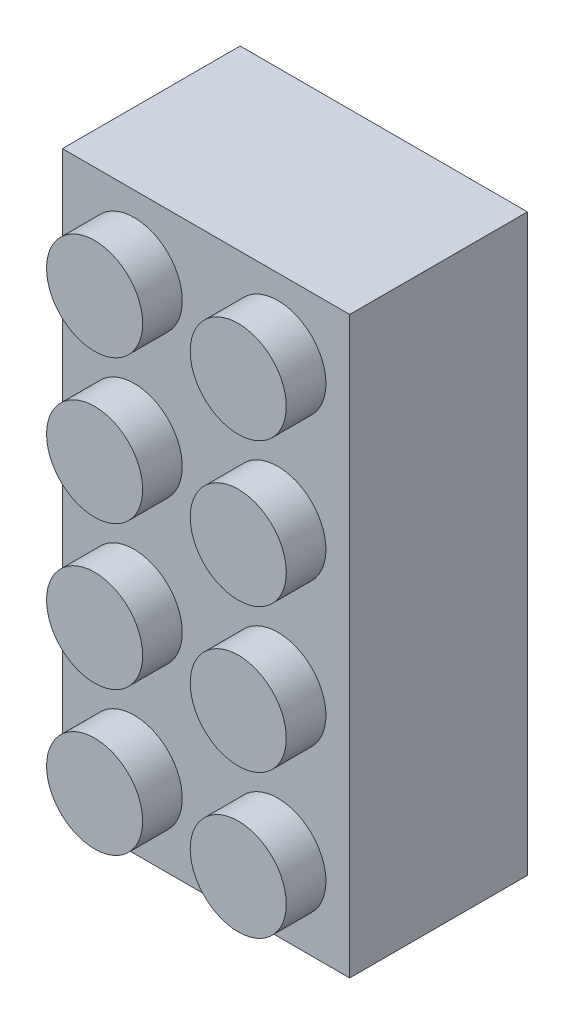
ISO-10303-21;
HEADER;
FILE_DESCRIPTION(('STEP AP214'),'2;1');
FILE_NAME('part.step','',(''),(''),'','','');
FILE_SCHEMA(('AUTOMOTIVE_DESIGN { 1 0 10303 214 1 1 1 1 }'));
ENDSEC;
DATA;
#1=APPLICATION_CONTEXT('core data for automotive mechanical design processes');
#2=APPLICATION_PROTOCOL_DEFINITION('international standard','automotive_design',2000,#1);
#3=PRODUCT_CONTEXT('',#1,'mechanical');
#4=PRODUCT('Part','Part','',(#3));
#5=PRODUCT_RELATED_PRODUCT_CATEGORY('part','',(#4));
#6=PRODUCT_DEFINITION_FORMATION('','',#4);
#7=PRODUCT_DEFINITION_CONTEXT('part definition',#1,'design');
#8=PRODUCT_DEFINITION('design','',#6,#7);
#9=PRODUCT_DEFINITION_SHAPE('','',#8);
#10=(LENGTH_UNIT() NAMED_UNIT(*) SI_UNIT(.MILLI.,.METRE.));
#11=(NAMED_UNIT(*) PLANE_ANGLE_UNIT() SI_UNIT($,.RADIAN.));
#12=(NAMED_UNIT(*) SI_UNIT($,.STERADIAN.) SOLID_ANGLE_UNIT());
#13=UNCERTAINTY_MEASURE_WITH_UNIT(LENGTH_MEASURE(1.E-05),#10,'distance_accuracy_value','');
#14=(GEOMETRIC_REPRESENTATION_CONTEXT(3) GLOBAL_UNCERTAINTY_ASSIGNED_CONTEXT((#13)) GLOBAL_UNIT_ASSIGNED_CONTEXT((#10,
#11,#12)) REPRESENTATION_CONTEXT('',''));
#15=CARTESIAN_POINT('',(0.,0.,0.));
#16=DIRECTION('',(0.,0.,1.));
#17=DIRECTION('',(1.,0.,0.));
#18=AXIS2_PLACEMENT_3D('',#15,#16,#17);
#19=CARTESIAN_POINT('',(-47.4341050467337,-10.483954881613,12.5497480286861));
#20=DIRECTION('',(0.,0.,-1.));
#21=DIRECTION('',(-1.,0.,0.));
#22=AXIS2_PLACEMENT_3D('',#19,#20,#21);
#23=PLANE('',#22);
#24=DIRECTION('',(-1.,0.,0.));
#25=VECTOR('',#24,1.);
#26=CARTESIAN_POINT('',(-47.4341050467337,85.2160451183871,12.5497480286861));
#27=LINE('',#26,#25);
#28=CARTESIAN_POINT('',(48.2658949532663,85.2160451183871,12.5497480286861));
#29=VERTEX_POINT('',#28);
#30=CARTESIAN_POINT('',(-47.4341050467337,85.2160451183871,12.5497480286861));
#31=VERTEX_POINT('',#30);
#32=EDGE_CURVE('E92',#29,#31,#27,.T.);
#33=ORIENTED_EDGE('',*,*,#32,.F.);
#34=DIRECTION('',(0.,1.,0.));
#35=VECTOR('',#34,1.);
#36=CARTESIAN_POINT('',(48.2658949532663,85.2160451183871,12.5497480286861));
#37=LINE('',#36,#35);
#38=CARTESIAN_POINT('',(48.2658949532664,-106.183954881613,12.5497480286861));
#39=VERTEX_POINT('',#38);
#40=EDGE_CURVE('E74',#39,#29,#37,.T.);
#41=ORIENTED_EDGE('',*,*,#40,.F.);
#42=DIRECTION('',(1.,0.,0.));
#43=VECTOR('',#42,1.);
#44=CARTESIAN_POINT('',(48.2658949532664,-106.183954881613,12.5497480286861));
#45=LINE('',#44,#43);
#46=CARTESIAN_POINT('',(-47.4341050467337,-106.183954881613,12.5497480286861));
#47=VERTEX_POINT('',#46);
#48=EDGE_CURVE('E211',#47,#39,#45,.T.);
#49=ORIENTED_EDGE('',*,*,#48,.F.);
#50=DIRECTION('',(0.,-1.,0.));
#51=VECTOR('',#50,1.);
#52=CARTESIAN_POINT('',(-47.4341050467337,85.2160451183871,12.5497480286861));
#53=LINE('',#52,#51);
#54=EDGE_CURVE('E87',#31,#47,#53,.T.);
#55=ORIENTED_EDGE('',*,*,#54,.F.);
#56=EDGE_LOOP('',(#33,#41,#49,#55));
#57=FACE_BOUND('',#56,.T.);
#58=DIRECTION('',(1.,0.,0.));
#59=VECTOR('',#58,1.);
#60=CARTESIAN_POINT('',(-47.4341050467337,-1.88395488161296,12.5497480286861));
#61=LINE('',#60,#59);
#62=CARTESIAN_POINT('',(-38.8341050467337,-1.88395488161296,12.5497480286861));
#63=VERTEX_POINT('',#62);
#64=CARTESIAN_POINT('',(39.6658949532663,-1.88395488161296,12.5497480286861));
#65=VERTEX_POINT('',#64);
#66=EDGE_CURVE('E168',#63,#65,#61,.T.);
#67=ORIENTED_EDGE('',*,*,#66,.T.);
#68=DIRECTION('',(0.,1.,0.));
#69=VECTOR('',#68,1.);
#70=CARTESIAN_POINT('',(39.6658949532663,-10.483954881613,12.5497480286861));
#71=LINE('',#70,#69);
#72=CARTESIAN_POINT('',(39.6658949532663,76.6160451183871,12.5497480286861));
#73=VERTEX_POINT('',#72);
#74=EDGE_CURVE('E51',#65,#73,#71,.T.);
#75=ORIENTED_EDGE('',*,*,#74,.T.);
#76=DIRECTION('',(-1.,0.,0.));
#77=VECTOR('',#76,1.);
#78=CARTESIAN_POINT('',(-47.4341050467337,76.6160451183871,12.5497480286861));
#79=LINE('',#78,#77);
#80=CARTESIAN_POINT('',(-38.8341050467337,76.6160451183871,12.5497480286861));
#81=VERTEX_POINT('',#80);
#82=EDGE_CURVE('E152',#73,#81,#79,.T.);
#83=ORIENTED_EDGE('',*,*,#82,.T.);
#84=DIRECTION('',(0.,-1.,0.));
#85=VECTOR('',#84,1.);
#86=CARTESIAN_POINT('',(-38.8341050467337,-10.483954881613,12.5497480286861));
#87=LINE('',#86,#85);
#88=EDGE_CURVE('E171',#81,#63,#87,.T.);
#89=ORIENTED_EDGE('',*,*,#88,.T.);
#90=EDGE_LOOP('',(#67,#75,#83,#89));
#91=FACE_BOUND('',#90,.T.);
#92=DIRECTION('',(1.,0.,0.));
#93=VECTOR('',#92,1.);
#94=CARTESIAN_POINT('',(-47.4341050467337,-97.583954881613,12.5497480286861));
#95=LINE('',#94,#93);
#96=CARTESIAN_POINT('',(-38.8341050467337,-97.583954881613,12.5497480286861));
#97=VERTEX_POINT('',#96);
#98=CARTESIAN_POINT('',(39.6658949532664,-97.583954881613,12.5497480286861));
#99=VERTEX_POINT('',#98);
#100=EDGE_CURVE('E249',#97,#99,#95,.T.);
#101=ORIENTED_EDGE('',*,*,#100,.T.);
#102=DIRECTION('',(0.,1.,0.));
#103=VECTOR('',#102,1.);
#104=CARTESIAN_POINT('',(39.6658949532664,-106.183954881613,12.5497480286861));
#105=LINE('',#104,#103);
#106=CARTESIAN_POINT('',(39.6658949532664,-19.083954881613,12.5497480286861));
#107=VERTEX_POINT('',#106);
#108=EDGE_CURVE('E252',#99,#107,#105,.T.);
#109=ORIENTED_EDGE('',*,*,#108,.T.);
#110=DIRECTION('',(-1.,0.,0.));
#111=VECTOR('',#110,1.);
#112=CARTESIAN_POINT('',(-47.4341050467337,-19.083954881613,12.5497480286861));
#113=LINE('',#112,#111);
#114=CARTESIAN_POINT('',(-38.8341050467337,-19.083954881613,12.5497480286861));
#115=VERTEX_POINT('',#114);
#116=EDGE_CURVE('E242',#107,#115,#113,.T.);
#117=ORIENTED_EDGE('',*,*,#116,.T.);
#118=DIRECTION('',(0.,-1.,0.));
#119=VECTOR('',#118,1.);
#120=CARTESIAN_POINT('',(-38.8341050467337,-106.183954881613,12.5497480286861));
#121=LINE('',#120,#119);
#122=EDGE_CURVE('E246',#115,#97,#121,.T.);
#123=ORIENTED_EDGE('',*,*,#122,.T.);
#124=EDGE_LOOP('',(#101,#109,#117,#123));
#125=FACE_BOUND('',#124,.T.);
#126=ADVANCED_FACE('F36',(#57,#91,#125),#23,.T.);
#127=CARTESIAN_POINT('',(-47.4341050467337,85.2160451183871,71.7497480286861));
#128=DIRECTION('',(0.,-1.,0.));
#129=DIRECTION('',(1.,0.,0.));
#130=AXIS2_PLACEMENT_3D('',#127,#128,#129);
#131=PLANE('',#130);
#132=ORIENTED_EDGE('',*,*,#32,.T.);
#133=DIRECTION('',(0.,0.,-1.));
#134=VECTOR('',#133,1.);
#135=CARTESIAN_POINT('',(-47.4341050467337,85.2160451183871,71.7497480286861));
#136=LINE('',#135,#134);
#137=CARTESIAN_POINT('',(-47.4341050467337,85.2160451183871,71.7497480286861));
#138=VERTEX_POINT('',#137);
#139=EDGE_CURVE('E93',#138,#31,#136,.T.);
#140=ORIENTED_EDGE('',*,*,#139,.F.);
#141=DIRECTION('',(-1.,0.,0.));
#142=VECTOR('',#141,1.);
#143=CARTESIAN_POINT('',(-47.4341050467337,85.2160451183871,71.7497480286861));
#144=LINE('',#143,#142);
#145=CARTESIAN_POINT('',(48.2658949532663,85.2160451183871,71.7497480286861));
#146=VERTEX_POINT('',#145);
#147=EDGE_CURVE('E86',#146,#138,#144,.T.);
#148=ORIENTED_EDGE('',*,*,#147,.F.);
#149=DIRECTION('',(0.,0.,-1.));
#150=VECTOR('',#149,1.);
#151=CARTESIAN_POINT('',(48.2658949532663,85.2160451183871,71.7497480286861));
#152=LINE('',#151,#150);
#153=EDGE_CURVE('E77',#146,#29,#152,.T.);
#154=ORIENTED_EDGE('',*,*,#153,.T.);
#155=EDGE_LOOP('',(#132,#140,#148,#154));
#156=FACE_BOUND('',#155,.T.);
#157=ADVANCED_FACE('F38',(#156),#131,.F.);
#158=CARTESIAN_POINT('',(-47.4341050467337,85.2160451183871,71.7497480286861));
#159=DIRECTION('',(1.,0.,0.));
#160=DIRECTION('',(0.,1.,0.));
#161=AXIS2_PLACEMENT_3D('',#158,#159,#160);
#162=PLANE('',#161);
#163=ORIENTED_EDGE('',*,*,#54,.T.);
#164=DIRECTION('',(0.,0.,-1.));
#165=VECTOR('',#164,1.);
#166=CARTESIAN_POINT('',(-47.4341050467337,-106.183954881613,71.7497480286861));
#167=LINE('',#166,#165);
#168=CARTESIAN_POINT('',(-47.4341050467337,-106.183954881613,71.7497480286861));
#169=VERTEX_POINT('',#168);
#170=EDGE_CURVE('E134',#169,#47,#167,.T.);
#171=ORIENTED_EDGE('',*,*,#170,.F.);
#172=DIRECTION('',(0.,-1.,0.));
#173=VECTOR('',#172,1.);
#174=CARTESIAN_POINT('',(-47.4341050467337,85.2160451183871,71.7497480286861));
#175=LINE('',#174,#173);
#176=EDGE_CURVE('E199',#138,#169,#175,.T.);
#177=ORIENTED_EDGE('',*,*,#176,.F.);
#178=ORIENTED_EDGE('',*,*,#139,.T.);
#179=EDGE_LOOP('',(#163,#171,#177,#178));
#180=FACE_BOUND('',#179,.T.);
#181=ADVANCED_FACE('F207',(#180),#162,.F.);
#182=CARTESIAN_POINT('',(48.2658949532663,85.2160451183871,71.7497480286861));
#183=DIRECTION('',(-1.,0.,0.));
#184=DIRECTION('',(0.,-1.,0.));
#185=AXIS2_PLACEMENT_3D('',#182,#183,#184);
#186=PLANE('',#185);
#187=ORIENTED_EDGE('',*,*,#40,.T.);
#188=ORIENTED_EDGE('',*,*,#153,.F.);
#189=DIRECTION('',(0.,1.,0.));
#190=VECTOR('',#189,1.);
#191=CARTESIAN_POINT('',(48.2658949532663,85.2160451183871,71.7497480286861));
#192=LINE('',#191,#190);
#193=CARTESIAN_POINT('',(48.2658949532664,-106.183954881613,71.7497480286861));
#194=VERTEX_POINT('',#193);
#195=EDGE_CURVE('E60',#194,#146,#192,.T.);
#196=ORIENTED_EDGE('',*,*,#195,.F.);
#197=DIRECTION('',(0.,0.,-1.));
#198=VECTOR('',#197,1.);
#199=CARTESIAN_POINT('',(48.2658949532664,-106.183954881613,71.7497480286861));
#200=LINE('',#199,#198);
#201=EDGE_CURVE('E81',#194,#39,#200,.T.);
#202=ORIENTED_EDGE('',*,*,#201,.T.);
#203=EDGE_LOOP('',(#187,#188,#196,#202));
#204=FACE_BOUND('',#203,.T.);
#205=ADVANCED_FACE('F76',(#204),#186,.F.);
#206=CARTESIAN_POINT('',(-47.4341050467337,-10.483954881613,71.7497480286861));
#207=DIRECTION('',(0.,0.,-1.));
#208=DIRECTION('',(-1.,0.,0.));
#209=AXIS2_PLACEMENT_3D('',#206,#207,#208);
#210=PLANE('',#209);
#211=CARTESIAN_POINT('',(-23.5091050467337,13.441045118387,71.7497480286861));
#212=DIRECTION('',(0.,0.,-1.));
#213=DIRECTION('',(-1.,0.,0.));
#214=AXIS2_PLACEMENT_3D('',#211,#212,#213);
#215=CIRCLE('',#214,16.);
#216=CARTESIAN_POINT('',(-39.5091050467336,13.441045118387,71.7497480286861));
#217=VERTEX_POINT('',#216);
#218=EDGE_CURVE('E186',#217,#217,#215,.T.);
#219=ORIENTED_EDGE('',*,*,#218,.T.);
#220=EDGE_LOOP('',(#219));
#221=FACE_BOUND('',#220,.T.);
#222=CARTESIAN_POINT('',(24.3408949532663,13.441045118387,71.7497480286861));
#223=DIRECTION('',(0.,0.,-1.));
#224=DIRECTION('',(-1.,0.,0.));
#225=AXIS2_PLACEMENT_3D('',#222,#223,#224);
#226=CIRCLE('',#225,16.);
#227=CARTESIAN_POINT('',(8.34089495326637,13.441045118387,71.7497480286861));
#228=VERTEX_POINT('',#227);
#229=EDGE_CURVE('E11',#228,#228,#226,.F.);
#230=ORIENTED_EDGE('',*,*,#229,.F.);
#231=EDGE_LOOP('',(#230));
#232=FACE_BOUND('',#231,.T.);
#233=CARTESIAN_POINT('',(24.3408949532663,61.2910451183871,71.7497480286861));
#234=DIRECTION('',(0.,0.,-1.));
#235=DIRECTION('',(-1.,0.,0.));
#236=AXIS2_PLACEMENT_3D('',#233,#234,#235);
#237=CIRCLE('',#236,16.);
#238=CARTESIAN_POINT('',(8.34089495326635,61.2910451183871,71.7497480286861));
#239=VERTEX_POINT('',#238);
#240=EDGE_CURVE('E102',#239,#239,#237,.T.);
#241=ORIENTED_EDGE('',*,*,#240,.T.);
#242=EDGE_LOOP('',(#241));
#243=FACE_BOUND('',#242,.T.);
#244=CARTESIAN_POINT('',(-23.5091050467337,61.2910451183871,71.7497480286861));
#245=DIRECTION('',(0.,0.,-1.));
#246=DIRECTION('',(-1.,0.,0.));
#247=AXIS2_PLACEMENT_3D('',#244,#245,#246);
#248=CIRCLE('',#247,16.);
#249=CARTESIAN_POINT('',(-39.5091050467337,61.2910451183871,71.7497480286861));
#250=VERTEX_POINT('',#249);
#251=EDGE_CURVE('E44',#250,#250,#248,.F.);
#252=ORIENTED_EDGE('',*,*,#251,.F.);
#253=EDGE_LOOP('',(#252));
#254=FACE_BOUND('',#253,.T.);
#255=ORIENTED_EDGE('',*,*,#147,.T.);
#256=ORIENTED_EDGE('',*,*,#176,.T.);
#257=DIRECTION('',(1.,0.,0.));
#258=VECTOR('',#257,1.);
#259=CARTESIAN_POINT('',(48.2658949532664,-106.183954881613,71.7497480286861));
#260=LINE('',#259,#258);
#261=EDGE_CURVE('E204',#169,#194,#260,.T.);
#262=ORIENTED_EDGE('',*,*,#261,.T.);
#263=ORIENTED_EDGE('',*,*,#195,.T.);
#264=EDGE_LOOP('',(#255,#256,#262,#263));
#265=FACE_BOUND('',#264,.T.);
#266=CARTESIAN_POINT('',(-23.5091050467337,-82.258954881613,71.7497480286861));
#267=DIRECTION('',(0.,0.,-1.));
#268=DIRECTION('',(-1.,0.,0.));
#269=AXIS2_PLACEMENT_3D('',#266,#267,#268);
#270=CIRCLE('',#269,16.);
#271=CARTESIAN_POINT('',(-39.5091050467336,-82.258954881613,71.7497480286861));
#272=VERTEX_POINT('',#271);
#273=EDGE_CURVE('E121',#272,#272,#270,.T.);
#274=ORIENTED_EDGE('',*,*,#273,.T.);
#275=EDGE_LOOP('',(#274));
#276=FACE_BOUND('',#275,.T.);
#277=CARTESIAN_POINT('',(24.3408949532664,-82.258954881613,71.7497480286861));
#278=DIRECTION('',(0.,0.,-1.));
#279=DIRECTION('',(-1.,0.,0.));
#280=AXIS2_PLACEMENT_3D('',#277,#278,#279);
#281=CIRCLE('',#280,16.);
#282=CARTESIAN_POINT('',(8.34089495326639,-82.258954881613,71.7497480286861));
#283=VERTEX_POINT('',#282);
#284=EDGE_CURVE('E125',#283,#283,#281,.F.);
#285=ORIENTED_EDGE('',*,*,#284,.F.);
#286=EDGE_LOOP('',(#285));
#287=FACE_BOUND('',#286,.T.);
#288=CARTESIAN_POINT('',(24.3408949532664,-34.408954881613,71.7497480286861));
#289=DIRECTION('',(0.,0.,-1.));
#290=DIRECTION('',(-1.,0.,0.));
#291=AXIS2_PLACEMENT_3D('',#288,#289,#290);
#292=CIRCLE('',#291,16.);
#293=CARTESIAN_POINT('',(8.34089495326636,-34.408954881613,71.7497480286861));
#294=VERTEX_POINT('',#293);
#295=EDGE_CURVE('E129',#294,#294,#292,.T.);
#296=ORIENTED_EDGE('',*,*,#295,.T.);
#297=EDGE_LOOP('',(#296));
#298=FACE_BOUND('',#297,.T.);
#299=CARTESIAN_POINT('',(-23.5091050467337,-34.408954881613,71.7497480286861));
#300=DIRECTION('',(0.,0.,-1.));
#301=DIRECTION('',(-1.,0.,0.));
#302=AXIS2_PLACEMENT_3D('',#299,#300,#301);
#303=CIRCLE('',#302,16.);
#304=CARTESIAN_POINT('',(-39.5091050467337,-34.408954881613,71.7497480286861));
#305=VERTEX_POINT('',#304);
#306=EDGE_CURVE('E132',#305,#305,#303,.F.);
#307=ORIENTED_EDGE('',*,*,#306,.F.);
#308=EDGE_LOOP('',(#307));
#309=FACE_BOUND('',#308,.T.);
#310=ADVANCED_FACE('F112',(#221,#232,#243,#254,#265,#276,#287,#298,#309),#210,.F.);
#311=CARTESIAN_POINT('',(-23.5091050467337,61.2910451183871,84.9497480286861));
#312=DIRECTION('',(0.,0.,-1.));
#313=DIRECTION('',(-1.,0.,0.));
#314=AXIS2_PLACEMENT_3D('',#311,#312,#313);
#315=CYLINDRICAL_SURFACE('',#314,16.);
#316=CARTESIAN_POINT('',(-23.5091050467337,61.2910451183871,84.9497480286861));
#317=DIRECTION('',(0.,0.,1.));
#318=DIRECTION('',(1.,0.,0.));
#319=AXIS2_PLACEMENT_3D('',#316,#317,#318);
#320=CIRCLE('',#319,16.);
#321=CARTESIAN_POINT('',(-7.50910504673368,61.2910451183871,84.9497480286861));
#322=VERTEX_POINT('',#321);
#323=EDGE_CURVE('E98',#322,#322,#320,.T.);
#324=ORIENTED_EDGE('',*,*,#323,.F.);
#325=EDGE_LOOP('',(#324));
#326=FACE_BOUND('',#325,.T.);
#327=ORIENTED_EDGE('',*,*,#251,.T.);
#328=EDGE_LOOP('',(#327));
#329=FACE_BOUND('',#328,.T.);
#330=ADVANCED_FACE('F110',(#326,#329),#315,.T.);
#331=CARTESIAN_POINT('',(-23.5091050467337,61.2910451183871,84.9497480286861));
#332=DIRECTION('',(0.,0.,1.));
#333=DIRECTION('',(1.,0.,0.));
#334=AXIS2_PLACEMENT_3D('',#331,#332,#333);
#335=PLANE('',#334);
#336=ORIENTED_EDGE('',*,*,#323,.T.);
#337=EDGE_LOOP('',(#336));
#338=FACE_BOUND('',#337,.T.);
#339=ADVANCED_FACE('F372',(#338),#335,.T.);
#340=CARTESIAN_POINT('',(24.3408949532663,61.2910451183871,84.9497480286861));
#341=DIRECTION('',(0.,0.,-1.));
#342=DIRECTION('',(-1.,0.,0.));
#343=AXIS2_PLACEMENT_3D('',#340,#341,#342);
#344=CYLINDRICAL_SURFACE('',#343,16.);
#345=CARTESIAN_POINT('',(24.3408949532663,61.2910451183871,84.9497480286861));
#346=DIRECTION('',(0.,0.,-1.));
#347=DIRECTION('',(-1.,0.,0.));
#348=AXIS2_PLACEMENT_3D('',#345,#346,#347);
#349=CIRCLE('',#348,16.);
#350=CARTESIAN_POINT('',(8.34089495326635,61.2910451183871,84.9497480286861));
#351=VERTEX_POINT('',#350);
#352=EDGE_CURVE('E194',#351,#351,#349,.T.);
#353=ORIENTED_EDGE('',*,*,#352,.T.);
#354=EDGE_LOOP('',(#353));
#355=FACE_BOUND('',#354,.T.);
#356=ORIENTED_EDGE('',*,*,#240,.F.);
#357=EDGE_LOOP('',(#356));
#358=FACE_BOUND('',#357,.T.);
#359=ADVANCED_FACE('F369',(#355,#358),#344,.T.);
#360=CARTESIAN_POINT('',(24.3408949532663,61.2910451183871,84.9497480286861));
#361=DIRECTION('',(0.,0.,-1.));
#362=DIRECTION('',(-1.,0.,0.));
#363=AXIS2_PLACEMENT_3D('',#360,#361,#362);
#364=PLANE('',#363);
#365=ORIENTED_EDGE('',*,*,#352,.F.);
#366=EDGE_LOOP('',(#365));
#367=FACE_BOUND('',#366,.T.);
#368=ADVANCED_FACE('F364',(#367),#364,.F.);
#369=CARTESIAN_POINT('',(24.3408949532663,13.441045118387,84.9497480286861));
#370=DIRECTION('',(0.,0.,-1.));
#371=DIRECTION('',(-1.,0.,0.));
#372=AXIS2_PLACEMENT_3D('',#369,#370,#371);
#373=CYLINDRICAL_SURFACE('',#372,16.);
#374=CARTESIAN_POINT('',(24.3408949532663,13.441045118387,84.9497480286861));
#375=DIRECTION('',(0.,0.,1.));
#376=DIRECTION('',(1.,0.,0.));
#377=AXIS2_PLACEMENT_3D('',#374,#375,#376);
#378=CIRCLE('',#377,16.);
#379=CARTESIAN_POINT('',(40.3408949532663,13.441045118387,84.9497480286861));
#380=VERTEX_POINT('',#379);
#381=EDGE_CURVE('E189',#380,#380,#378,.T.);
#382=ORIENTED_EDGE('',*,*,#381,.F.);
#383=EDGE_LOOP('',(#382));
#384=FACE_BOUND('',#383,.T.);
#385=ORIENTED_EDGE('',*,*,#229,.T.);
#386=EDGE_LOOP('',(#385));
#387=FACE_BOUND('',#386,.T.);
#388=ADVANCED_FACE('F361',(#384,#387),#373,.T.);
#389=CARTESIAN_POINT('',(24.3408949532663,13.441045118387,84.9497480286861));
#390=DIRECTION('',(0.,0.,1.));
#391=DIRECTION('',(1.,0.,0.));
#392=AXIS2_PLACEMENT_3D('',#389,#390,#391);
#393=PLANE('',#392);
#394=ORIENTED_EDGE('',*,*,#381,.T.);
#395=EDGE_LOOP('',(#394));
#396=FACE_BOUND('',#395,.T.);
#397=ADVANCED_FACE('F356',(#396),#393,.T.);
#398=CARTESIAN_POINT('',(-23.5091050467337,13.441045118387,84.9497480286861));
#399=DIRECTION('',(0.,0.,-1.));
#400=DIRECTION('',(-1.,0.,0.));
#401=AXIS2_PLACEMENT_3D('',#398,#399,#400);
#402=CYLINDRICAL_SURFACE('',#401,16.);
#403=CARTESIAN_POINT('',(-23.5091050467337,13.441045118387,84.9497480286861));
#404=DIRECTION('',(0.,0.,-1.));
#405=DIRECTION('',(-1.,0.,0.));
#406=AXIS2_PLACEMENT_3D('',#403,#404,#405);
#407=CIRCLE('',#406,16.);
#408=CARTESIAN_POINT('',(-39.5091050467336,13.441045118387,84.9497480286861));
#409=VERTEX_POINT('',#408);
#410=EDGE_CURVE('E178',#409,#409,#407,.T.);
#411=ORIENTED_EDGE('',*,*,#410,.T.);
#412=EDGE_LOOP('',(#411));
#413=FACE_BOUND('',#412,.T.);
#414=ORIENTED_EDGE('',*,*,#218,.F.);
#415=EDGE_LOOP('',(#414));
#416=FACE_BOUND('',#415,.T.);
#417=ADVANCED_FACE('F352',(#413,#416),#402,.T.);
#418=CARTESIAN_POINT('',(-23.5091050467337,13.441045118387,84.9497480286861));
#419=DIRECTION('',(0.,0.,-1.));
#420=DIRECTION('',(-1.,0.,0.));
#421=AXIS2_PLACEMENT_3D('',#418,#419,#420);
#422=PLANE('',#421);
#423=ORIENTED_EDGE('',*,*,#410,.F.);
#424=EDGE_LOOP('',(#423));
#425=FACE_BOUND('',#424,.T.);
#426=ADVANCED_FACE('F355',(#425),#422,.F.);
#427=CARTESIAN_POINT('',(39.6658949532663,-10.483954881613,63.6497480286861));
#428=DIRECTION('',(-1.,0.,0.));
#429=DIRECTION('',(0.,0.,1.));
#430=AXIS2_PLACEMENT_3D('',#427,#428,#429);
#431=PLANE('',#430);
#432=ORIENTED_EDGE('',*,*,#74,.F.);
#433=DIRECTION('',(0.,0.,-1.));
#434=VECTOR('',#433,1.);
#435=CARTESIAN_POINT('',(39.6658949532663,-1.88395488161296,63.6497480286861));
#436=LINE('',#435,#434);
#437=CARTESIAN_POINT('',(39.6658949532663,-1.88395488161296,63.6497480286861));
#438=VERTEX_POINT('',#437);
#439=EDGE_CURVE('E164',#438,#65,#436,.T.);
#440=ORIENTED_EDGE('',*,*,#439,.F.);
#441=DIRECTION('',(0.,1.,0.));
#442=VECTOR('',#441,1.);
#443=CARTESIAN_POINT('',(39.6658949532663,-10.483954881613,63.6497480286861));
#444=LINE('',#443,#442);
#445=CARTESIAN_POINT('',(39.6658949532663,76.6160451183871,63.6497480286861));
#446=VERTEX_POINT('',#445);
#447=EDGE_CURVE('E151',#438,#446,#444,.T.);
#448=ORIENTED_EDGE('',*,*,#447,.T.);
#449=DIRECTION('',(0.,0.,-1.));
#450=VECTOR('',#449,1.);
#451=CARTESIAN_POINT('',(39.6658949532663,76.6160451183871,63.6497480286861));
#452=LINE('',#451,#450);
#453=EDGE_CURVE('E176',#446,#73,#452,.T.);
#454=ORIENTED_EDGE('',*,*,#453,.T.);
#455=EDGE_LOOP('',(#432,#440,#448,#454));
#456=FACE_BOUND('',#455,.T.);
#457=ADVANCED_FACE('F351',(#456),#431,.T.);
#458=CARTESIAN_POINT('',(-47.4341050467337,76.6160451183871,63.6497480286861));
#459=DIRECTION('',(0.,-1.,0.));
#460=DIRECTION('',(0.,0.,-1.));
#461=AXIS2_PLACEMENT_3D('',#458,#459,#460);
#462=PLANE('',#461);
#463=ORIENTED_EDGE('',*,*,#82,.F.);
#464=ORIENTED_EDGE('',*,*,#453,.F.);
#465=DIRECTION('',(-1.,0.,0.));
#466=VECTOR('',#465,1.);
#467=CARTESIAN_POINT('',(-47.4341050467337,76.6160451183871,63.6497480286861));
#468=LINE('',#467,#466);
#469=CARTESIAN_POINT('',(-38.8341050467337,76.6160451183871,63.6497480286861));
#470=VERTEX_POINT('',#469);
#471=EDGE_CURVE('E161',#446,#470,#468,.T.);
#472=ORIENTED_EDGE('',*,*,#471,.T.);
#473=DIRECTION('',(0.,0.,-1.));
#474=VECTOR('',#473,1.);
#475=CARTESIAN_POINT('',(-38.8341050467337,76.6160451183871,63.6497480286861));
#476=LINE('',#475,#474);
#477=EDGE_CURVE('E179',#470,#81,#476,.T.);
#478=ORIENTED_EDGE('',*,*,#477,.T.);
#479=EDGE_LOOP('',(#463,#464,#472,#478));
#480=FACE_BOUND('',#479,.T.);
#481=ADVANCED_FACE('F346',(#480),#462,.T.);
#482=CARTESIAN_POINT('',(-38.8341050467337,-10.483954881613,63.6497480286861));
#483=DIRECTION('',(1.,0.,0.));
#484=DIRECTION('',(0.,0.,-1.));
#485=AXIS2_PLACEMENT_3D('',#482,#483,#484);
#486=PLANE('',#485);
#487=ORIENTED_EDGE('',*,*,#88,.F.);
#488=ORIENTED_EDGE('',*,*,#477,.F.);
#489=DIRECTION('',(0.,-1.,0.));
#490=VECTOR('',#489,1.);
#491=CARTESIAN_POINT('',(-38.8341050467337,-10.483954881613,63.6497480286861));
#492=LINE('',#491,#490);
#493=CARTESIAN_POINT('',(-38.8341050467337,-1.88395488161296,63.6497480286861));
#494=VERTEX_POINT('',#493);
#495=EDGE_CURVE('E158',#470,#494,#492,.T.);
#496=ORIENTED_EDGE('',*,*,#495,.T.);
#497=DIRECTION('',(0.,0.,-1.));
#498=VECTOR('',#497,1.);
#499=CARTESIAN_POINT('',(-38.8341050467337,-1.88395488161296,63.6497480286861));
#500=LINE('',#499,#498);
#501=EDGE_CURVE('E182',#494,#63,#500,.T.);
#502=ORIENTED_EDGE('',*,*,#501,.T.);
#503=EDGE_LOOP('',(#487,#488,#496,#502));
#504=FACE_BOUND('',#503,.T.);
#505=ADVANCED_FACE('F337',(#504),#486,.T.);
#506=CARTESIAN_POINT('',(0.415894953266362,37.366045118387,63.6497480286861));
#507=DIRECTION('',(0.,0.,-1.));
#508=DIRECTION('',(-1.,0.,0.));
#509=AXIS2_PLACEMENT_3D('',#506,#507,#508);
#510=CYLINDRICAL_SURFACE('',#509,17.15);
#511=CARTESIAN_POINT('',(0.415894953266362,37.366045118387,63.6497480286861));
#512=DIRECTION('',(0.,0.,-1.));
#513=DIRECTION('',(-1.,0.,0.));
#514=AXIS2_PLACEMENT_3D('',#511,#512,#513);
#515=CIRCLE('',#514,17.15);
#516=CARTESIAN_POINT('',(-16.7341050467337,37.366045118387,63.6497480286861));
#517=VERTEX_POINT('',#516);
#518=EDGE_CURVE('E148',#517,#517,#515,.T.);
#519=ORIENTED_EDGE('',*,*,#518,.T.);
#520=EDGE_LOOP('',(#519));
#521=FACE_BOUND('',#520,.T.);
#522=CARTESIAN_POINT('',(0.415894953266362,37.366045118387,12.5497480286861));
#523=DIRECTION('',(0.,0.,-1.));
#524=DIRECTION('',(-1.,0.,0.));
#525=AXIS2_PLACEMENT_3D('',#522,#523,#524);
#526=CIRCLE('',#525,17.15);
#527=CARTESIAN_POINT('',(-16.7341050467337,37.366045118387,12.5497480286861));
#528=VERTEX_POINT('',#527);
#529=EDGE_CURVE('E145',#528,#528,#526,.T.);
#530=ORIENTED_EDGE('',*,*,#529,.F.);
#531=EDGE_LOOP('',(#530));
#532=FACE_BOUND('',#531,.T.);
#533=ADVANCED_FACE('F335',(#521,#532),#510,.T.);
#534=CARTESIAN_POINT('',(-47.4341050467337,-1.88395488161296,63.6497480286861));
#535=DIRECTION('',(0.,1.,0.));
#536=DIRECTION('',(0.,0.,1.));
#537=AXIS2_PLACEMENT_3D('',#534,#535,#536);
#538=PLANE('',#537);
#539=ORIENTED_EDGE('',*,*,#66,.F.);
#540=ORIENTED_EDGE('',*,*,#501,.F.);
#541=DIRECTION('',(1.,0.,0.));
#542=VECTOR('',#541,1.);
#543=CARTESIAN_POINT('',(-47.4341050467337,-1.88395488161296,63.6497480286861));
#544=LINE('',#543,#542);
#545=EDGE_CURVE('E155',#494,#438,#544,.T.);
#546=ORIENTED_EDGE('',*,*,#545,.T.);
#547=ORIENTED_EDGE('',*,*,#439,.T.);
#548=EDGE_LOOP('',(#539,#540,#546,#547));
#549=FACE_BOUND('',#548,.T.);
#550=ADVANCED_FACE('F328',(#549),#538,.T.);
#551=CARTESIAN_POINT('',(-47.4341050467337,-10.483954881613,63.6497480286861));
#552=DIRECTION('',(0.,0.,-1.));
#553=DIRECTION('',(-1.,0.,0.));
#554=AXIS2_PLACEMENT_3D('',#551,#552,#553);
#555=PLANE('',#554);
#556=ORIENTED_EDGE('',*,*,#518,.F.);
#557=EDGE_LOOP('',(#556));
#558=FACE_BOUND('',#557,.T.);
#559=ORIENTED_EDGE('',*,*,#447,.F.);
#560=ORIENTED_EDGE('',*,*,#545,.F.);
#561=ORIENTED_EDGE('',*,*,#495,.F.);
#562=ORIENTED_EDGE('',*,*,#471,.F.);
#563=EDGE_LOOP('',(#559,#560,#561,#562));
#564=FACE_BOUND('',#563,.T.);
#565=ADVANCED_FACE('F319',(#558,#564),#555,.T.);
#566=CARTESIAN_POINT('',(0.415894953266362,37.366045118387,12.5497480286861));
#567=DIRECTION('',(0.,0.,-1.));
#568=DIRECTION('',(-1.,0.,0.));
#569=AXIS2_PLACEMENT_3D('',#566,#567,#568);
#570=CIRCLE('',#569,9.75000000000002);
#571=CARTESIAN_POINT('',(-9.33410504673366,37.366045118387,12.5497480286861));
#572=VERTEX_POINT('',#571);
#573=EDGE_CURVE('E136',#572,#572,#570,.T.);
#574=ORIENTED_EDGE('',*,*,#573,.F.);
#575=EDGE_LOOP('',(#574));
#576=FACE_BOUND('',#575,.T.);
#577=ORIENTED_EDGE('',*,*,#529,.T.);
#578=EDGE_LOOP('',(#577));
#579=FACE_BOUND('',#578,.T.);
#580=ADVANCED_FACE('F312',(#576,#579),#23,.T.);
#581=CARTESIAN_POINT('',(0.415894953266362,37.366045118387,63.6497480286861));
#582=DIRECTION('',(0.,0.,-1.));
#583=DIRECTION('',(-1.,0.,0.));
#584=AXIS2_PLACEMENT_3D('',#581,#582,#583);
#585=CYLINDRICAL_SURFACE('',#584,9.75000000000002);
#586=CARTESIAN_POINT('',(0.415894953266362,37.366045118387,63.6497480286861));
#587=DIRECTION('',(0.,0.,-1.));
#588=DIRECTION('',(-1.,0.,0.));
#589=AXIS2_PLACEMENT_3D('',#586,#587,#588);
#590=CIRCLE('',#589,9.75000000000002);
#591=CARTESIAN_POINT('',(-9.33410504673366,37.366045118387,63.6497480286861));
#592=VERTEX_POINT('',#591);
#593=EDGE_CURVE('E142',#592,#592,#590,.T.);
#594=ORIENTED_EDGE('',*,*,#593,.F.);
#595=EDGE_LOOP('',(#594));
#596=FACE_BOUND('',#595,.T.);
#597=ORIENTED_EDGE('',*,*,#573,.T.);
#598=EDGE_LOOP('',(#597));
#599=FACE_BOUND('',#598,.T.);
#600=ADVANCED_FACE('F318',(#596,#599),#585,.F.);
#601=CARTESIAN_POINT('',(-47.4341050467337,-10.483954881613,63.6497480286861));
#602=DIRECTION('',(0.,0.,-1.));
#603=DIRECTION('',(-1.,0.,0.));
#604=AXIS2_PLACEMENT_3D('',#601,#602,#603);
#605=PLANE('',#604);
#606=ORIENTED_EDGE('',*,*,#593,.T.);
#607=EDGE_LOOP('',(#606));
#608=FACE_BOUND('',#607,.T.);
#609=ADVANCED_FACE('F325',(#608),#605,.T.);
#610=CARTESIAN_POINT('',(48.2658949532664,-106.183954881613,71.7497480286861));
#611=DIRECTION('',(0.,1.,0.));
#612=DIRECTION('',(0.,0.,1.));
#613=AXIS2_PLACEMENT_3D('',#610,#611,#612);
#614=PLANE('',#613);
#615=ORIENTED_EDGE('',*,*,#48,.T.);
#616=ORIENTED_EDGE('',*,*,#201,.F.);
#617=ORIENTED_EDGE('',*,*,#261,.F.);
#618=ORIENTED_EDGE('',*,*,#170,.T.);
#619=EDGE_LOOP('',(#615,#616,#617,#618));
#620=FACE_BOUND('',#619,.T.);
#621=ADVANCED_FACE('F210',(#620),#614,.F.);
#622=CARTESIAN_POINT('',(-23.5091050467337,-34.408954881613,84.9497480286861));
#623=DIRECTION('',(0.,0.,-1.));
#624=DIRECTION('',(-1.,0.,0.));
#625=AXIS2_PLACEMENT_3D('',#622,#623,#624);
#626=CYLINDRICAL_SURFACE('',#625,16.);
#627=CARTESIAN_POINT('',(-23.5091050467337,-34.408954881613,84.9497480286861));
#628=DIRECTION('',(0.,0.,1.));
#629=DIRECTION('',(1.,0.,0.));
#630=AXIS2_PLACEMENT_3D('',#627,#628,#629);
#631=CIRCLE('',#630,16.);
#632=CARTESIAN_POINT('',(-7.50910504673367,-34.408954881613,84.9497480286861));
#633=VERTEX_POINT('',#632);
#634=EDGE_CURVE('E213',#633,#633,#631,.T.);
#635=ORIENTED_EDGE('',*,*,#634,.F.);
#636=EDGE_LOOP('',(#635));
#637=FACE_BOUND('',#636,.T.);
#638=ORIENTED_EDGE('',*,*,#306,.T.);
#639=EDGE_LOOP('',(#638));
#640=FACE_BOUND('',#639,.T.);
#641=ADVANCED_FACE('F526',(#637,#640),#626,.T.);
#642=CARTESIAN_POINT('',(-23.5091050467337,-34.408954881613,84.9497480286861));
#643=DIRECTION('',(0.,0.,1.));
#644=DIRECTION('',(1.,0.,0.));
#645=AXIS2_PLACEMENT_3D('',#642,#643,#644);
#646=PLANE('',#645);
#647=ORIENTED_EDGE('',*,*,#634,.T.);
#648=EDGE_LOOP('',(#647));
#649=FACE_BOUND('',#648,.T.);
#650=ADVANCED_FACE('F535',(#649),#646,.T.);
#651=CARTESIAN_POINT('',(24.3408949532664,-34.408954881613,84.9497480286861));
#652=DIRECTION('',(0.,0.,-1.));
#653=DIRECTION('',(-1.,0.,0.));
#654=AXIS2_PLACEMENT_3D('',#651,#652,#653);
#655=CYLINDRICAL_SURFACE('',#654,16.);
#656=CARTESIAN_POINT('',(24.3408949532664,-34.408954881613,84.9497480286861));
#657=DIRECTION('',(0.,0.,-1.));
#658=DIRECTION('',(-1.,0.,0.));
#659=AXIS2_PLACEMENT_3D('',#656,#657,#658);
#660=CIRCLE('',#659,16.);
#661=CARTESIAN_POINT('',(8.34089495326636,-34.408954881613,84.9497480286861));
#662=VERTEX_POINT('',#661);
#663=EDGE_CURVE('E218',#662,#662,#660,.T.);
#664=ORIENTED_EDGE('',*,*,#663,.T.);
#665=EDGE_LOOP('',(#664));
#666=FACE_BOUND('',#665,.T.);
#667=ORIENTED_EDGE('',*,*,#295,.F.);
#668=EDGE_LOOP('',(#667));
#669=FACE_BOUND('',#668,.T.);
#670=ADVANCED_FACE('F545',(#666,#669),#655,.T.);
#671=CARTESIAN_POINT('',(24.3408949532664,-34.408954881613,84.9497480286861));
#672=DIRECTION('',(0.,0.,-1.));
#673=DIRECTION('',(-1.,0.,0.));
#674=AXIS2_PLACEMENT_3D('',#671,#672,#673);
#675=PLANE('',#674);
#676=ORIENTED_EDGE('',*,*,#663,.F.);
#677=EDGE_LOOP('',(#676));
#678=FACE_BOUND('',#677,.T.);
#679=ADVANCED_FACE('F555',(#678),#675,.F.);
#680=CARTESIAN_POINT('',(24.3408949532664,-82.258954881613,84.9497480286861));
#681=DIRECTION('',(0.,0.,-1.));
#682=DIRECTION('',(-1.,0.,0.));
#683=AXIS2_PLACEMENT_3D('',#680,#681,#682);
#684=CYLINDRICAL_SURFACE('',#683,16.);
#685=CARTESIAN_POINT('',(24.3408949532664,-82.258954881613,84.9497480286861));
#686=DIRECTION('',(0.,0.,1.));
#687=DIRECTION('',(1.,0.,0.));
#688=AXIS2_PLACEMENT_3D('',#685,#686,#687);
#689=CIRCLE('',#688,16.);
#690=CARTESIAN_POINT('',(40.3408949532663,-82.258954881613,84.9497480286861));
#691=VERTEX_POINT('',#690);
#692=EDGE_CURVE('E221',#691,#691,#689,.T.);
#693=ORIENTED_EDGE('',*,*,#692,.F.);
#694=EDGE_LOOP('',(#693));
#695=FACE_BOUND('',#694,.T.);
#696=ORIENTED_EDGE('',*,*,#284,.T.);
#697=EDGE_LOOP('',(#696));
#698=FACE_BOUND('',#697,.T.);
#699=ADVANCED_FACE('F565',(#695,#698),#684,.T.);
#700=CARTESIAN_POINT('',(24.3408949532664,-82.258954881613,84.9497480286861));
#701=DIRECTION('',(0.,0.,1.));
#702=DIRECTION('',(1.,0.,0.));
#703=AXIS2_PLACEMENT_3D('',#700,#701,#702);
#704=PLANE('',#703);
#705=ORIENTED_EDGE('',*,*,#692,.T.);
#706=EDGE_LOOP('',(#705));
#707=FACE_BOUND('',#706,.T.);
#708=ADVANCED_FACE('F575',(#707),#704,.T.);
#709=CARTESIAN_POINT('',(-23.5091050467337,-82.258954881613,84.9497480286861));
#710=DIRECTION('',(0.,0.,-1.));
#711=DIRECTION('',(-1.,0.,0.));
#712=AXIS2_PLACEMENT_3D('',#709,#710,#711);
#713=CYLINDRICAL_SURFACE('',#712,16.);
#714=CARTESIAN_POINT('',(-23.5091050467337,-82.258954881613,84.9497480286861));
#715=DIRECTION('',(0.,0.,-1.));
#716=DIRECTION('',(-1.,0.,0.));
#717=AXIS2_PLACEMENT_3D('',#714,#715,#716);
#718=CIRCLE('',#717,16.);
#719=CARTESIAN_POINT('',(-39.5091050467336,-82.258954881613,84.9497480286861));
#720=VERTEX_POINT('',#719);
#721=EDGE_CURVE('E225',#720,#720,#718,.T.);
#722=ORIENTED_EDGE('',*,*,#721,.T.);
#723=EDGE_LOOP('',(#722));
#724=FACE_BOUND('',#723,.T.);
#725=ORIENTED_EDGE('',*,*,#273,.F.);
#726=EDGE_LOOP('',(#725));
#727=FACE_BOUND('',#726,.T.);
#728=ADVANCED_FACE('F585',(#724,#727),#713,.T.);
#729=CARTESIAN_POINT('',(-23.5091050467337,-82.258954881613,84.9497480286861));
#730=DIRECTION('',(0.,0.,-1.));
#731=DIRECTION('',(-1.,0.,0.));
#732=AXIS2_PLACEMENT_3D('',#729,#730,#731);
#733=PLANE('',#732);
#734=ORIENTED_EDGE('',*,*,#721,.F.);
#735=EDGE_LOOP('',(#734));
#736=FACE_BOUND('',#735,.T.);
#737=ADVANCED_FACE('F595',(#736),#733,.F.);
#738=CARTESIAN_POINT('',(39.6658949532664,-106.183954881613,63.6497480286861));
#739=DIRECTION('',(-1.,0.,0.));
#740=DIRECTION('',(0.,0.,1.));
#741=AXIS2_PLACEMENT_3D('',#738,#739,#740);
#742=PLANE('',#741);
#743=ORIENTED_EDGE('',*,*,#108,.F.);
#744=DIRECTION('',(0.,0.,-1.));
#745=VECTOR('',#744,1.);
#746=CARTESIAN_POINT('',(39.6658949532664,-97.583954881613,63.6497480286861));
#747=LINE('',#746,#745);
#748=CARTESIAN_POINT('',(39.6658949532664,-97.583954881613,63.6497480286861));
#749=VERTEX_POINT('',#748);
#750=EDGE_CURVE('E230',#749,#99,#747,.T.);
#751=ORIENTED_EDGE('',*,*,#750,.F.);
#752=DIRECTION('',(0.,1.,0.));
#753=VECTOR('',#752,1.);
#754=CARTESIAN_POINT('',(39.6658949532664,-106.183954881613,63.6497480286861));
#755=LINE('',#754,#753);
#756=CARTESIAN_POINT('',(39.6658949532664,-19.083954881613,63.6497480286861));
#757=VERTEX_POINT('',#756);
#758=EDGE_CURVE('E267',#749,#757,#755,.T.);
#759=ORIENTED_EDGE('',*,*,#758,.T.);
#760=DIRECTION('',(0.,0.,-1.));
#761=VECTOR('',#760,1.);
#762=CARTESIAN_POINT('',(39.6658949532664,-19.083954881613,63.6497480286861));
#763=LINE('',#762,#761);
#764=EDGE_CURVE('E228',#757,#107,#763,.T.);
#765=ORIENTED_EDGE('',*,*,#764,.T.);
#766=EDGE_LOOP('',(#743,#751,#759,#765));
#767=FACE_BOUND('',#766,.T.);
#768=ADVANCED_FACE('F604',(#767),#742,.T.);
#769=CARTESIAN_POINT('',(-47.4341050467337,-19.083954881613,63.6497480286861));
#770=DIRECTION('',(0.,-1.,0.));
#771=DIRECTION('',(0.,0.,-1.));
#772=AXIS2_PLACEMENT_3D('',#769,#770,#771);
#773=PLANE('',#772);
#774=ORIENTED_EDGE('',*,*,#116,.F.);
#775=ORIENTED_EDGE('',*,*,#764,.F.);
#776=DIRECTION('',(-1.,0.,0.));
#777=VECTOR('',#776,1.);
#778=CARTESIAN_POINT('',(-47.4341050467337,-19.083954881613,63.6497480286861));
#779=LINE('',#778,#777);
#780=CARTESIAN_POINT('',(-38.8341050467337,-19.083954881613,63.6497480286861));
#781=VERTEX_POINT('',#780);
#782=EDGE_CURVE('E234',#757,#781,#779,.T.);
#783=ORIENTED_EDGE('',*,*,#782,.T.);
#784=DIRECTION('',(0.,0.,-1.));
#785=VECTOR('',#784,1.);
#786=CARTESIAN_POINT('',(-38.8341050467337,-19.083954881613,63.6497480286861));
#787=LINE('',#786,#785);
#788=EDGE_CURVE('E237',#781,#115,#787,.T.);
#789=ORIENTED_EDGE('',*,*,#788,.T.);
#790=EDGE_LOOP('',(#774,#775,#783,#789));
#791=FACE_BOUND('',#790,.T.);
#792=ADVANCED_FACE('F305',(#791),#773,.T.);
#793=CARTESIAN_POINT('',(-38.8341050467337,-106.183954881613,63.6497480286861));
#794=DIRECTION('',(1.,0.,0.));
#795=DIRECTION('',(0.,0.,-1.));
#796=AXIS2_PLACEMENT_3D('',#793,#794,#795);
#797=PLANE('',#796);
#798=ORIENTED_EDGE('',*,*,#122,.F.);
#799=ORIENTED_EDGE('',*,*,#788,.F.);
#800=DIRECTION('',(0.,-1.,0.));
#801=VECTOR('',#800,1.);
#802=CARTESIAN_POINT('',(-38.8341050467337,-106.183954881613,63.6497480286861));
#803=LINE('',#802,#801);
#804=CARTESIAN_POINT('',(-38.8341050467337,-97.583954881613,63.6497480286861));
#805=VERTEX_POINT('',#804);
#806=EDGE_CURVE('E261',#781,#805,#803,.T.);
#807=ORIENTED_EDGE('',*,*,#806,.T.);
#808=DIRECTION('',(0.,0.,-1.));
#809=VECTOR('',#808,1.);
#810=CARTESIAN_POINT('',(-38.8341050467337,-97.583954881613,63.6497480286861));
#811=LINE('',#810,#809);
#812=EDGE_CURVE('E233',#805,#97,#811,.T.);
#813=ORIENTED_EDGE('',*,*,#812,.T.);
#814=EDGE_LOOP('',(#798,#799,#807,#813));
#815=FACE_BOUND('',#814,.T.);
#816=ADVANCED_FACE('F296',(#815),#797,.T.);
#817=CARTESIAN_POINT('',(0.415894953266369,-58.333954881613,63.6497480286861));
#818=DIRECTION('',(0.,0.,-1.));
#819=DIRECTION('',(-1.,0.,0.));
#820=AXIS2_PLACEMENT_3D('',#817,#818,#819);
#821=CYLINDRICAL_SURFACE('',#820,17.15);
#822=CARTESIAN_POINT('',(0.415894953266369,-58.333954881613,63.6497480286861));
#823=DIRECTION('',(0.,0.,-1.));
#824=DIRECTION('',(-1.,0.,0.));
#825=AXIS2_PLACEMENT_3D('',#822,#823,#824);
#826=CIRCLE('',#825,17.15);
#827=CARTESIAN_POINT('',(-16.7341050467337,-58.333954881613,63.6497480286861));
#828=VERTEX_POINT('',#827);
#829=EDGE_CURVE('E245',#828,#828,#826,.T.);
#830=ORIENTED_EDGE('',*,*,#829,.T.);
#831=EDGE_LOOP('',(#830));
#832=FACE_BOUND('',#831,.T.);
#833=CARTESIAN_POINT('',(0.415894953266369,-58.333954881613,12.5497480286861));
#834=DIRECTION('',(0.,0.,-1.));
#835=DIRECTION('',(-1.,0.,0.));
#836=AXIS2_PLACEMENT_3D('',#833,#834,#835);
#837=CIRCLE('',#836,17.15);
#838=CARTESIAN_POINT('',(-16.7341050467337,-58.333954881613,12.5497480286861));
#839=VERTEX_POINT('',#838);
#840=EDGE_CURVE('E255',#839,#839,#837,.T.);
#841=ORIENTED_EDGE('',*,*,#840,.F.);
#842=EDGE_LOOP('',(#841));
#843=FACE_BOUND('',#842,.T.);
#844=ADVANCED_FACE('F293',(#832,#843),#821,.T.);
#845=CARTESIAN_POINT('',(-47.4341050467337,-97.583954881613,63.6497480286861));
#846=DIRECTION('',(0.,1.,0.));
#847=DIRECTION('',(0.,0.,1.));
#848=AXIS2_PLACEMENT_3D('',#845,#846,#847);
#849=PLANE('',#848);
#850=ORIENTED_EDGE('',*,*,#100,.F.);
#851=ORIENTED_EDGE('',*,*,#812,.F.);
#852=DIRECTION('',(1.,0.,0.));
#853=VECTOR('',#852,1.);
#854=CARTESIAN_POINT('',(-47.4341050467337,-97.583954881613,63.6497480286861));
#855=LINE('',#854,#853);
#856=EDGE_CURVE('E264',#805,#749,#855,.T.);
#857=ORIENTED_EDGE('',*,*,#856,.T.);
#858=ORIENTED_EDGE('',*,*,#750,.T.);
#859=EDGE_LOOP('',(#850,#851,#857,#858));
#860=FACE_BOUND('',#859,.T.);
#861=ADVANCED_FACE('F295',(#860),#849,.T.);
#862=CARTESIAN_POINT('',(-47.4341050467337,-106.183954881613,63.6497480286861));
#863=DIRECTION('',(0.,0.,-1.));
#864=DIRECTION('',(-1.,0.,0.));
#865=AXIS2_PLACEMENT_3D('',#862,#863,#864);
#866=PLANE('',#865);
#867=ORIENTED_EDGE('',*,*,#829,.F.);
#868=EDGE_LOOP('',(#867));
#869=FACE_BOUND('',#868,.T.);
#870=ORIENTED_EDGE('',*,*,#758,.F.);
#871=ORIENTED_EDGE('',*,*,#856,.F.);
#872=ORIENTED_EDGE('',*,*,#806,.F.);
#873=ORIENTED_EDGE('',*,*,#782,.F.);
#874=EDGE_LOOP('',(#870,#871,#872,#873));
#875=FACE_BOUND('',#874,.T.);
#876=ADVANCED_FACE('F289',(#869,#875),#866,.T.);
#877=CARTESIAN_POINT('',(-47.4341050467337,-106.183954881613,12.5497480286861));
#878=DIRECTION('',(0.,0.,-1.));
#879=DIRECTION('',(-1.,0.,0.));
#880=AXIS2_PLACEMENT_3D('',#877,#878,#879);
#881=PLANE('',#880);
#882=CARTESIAN_POINT('',(0.415894953266369,-58.333954881613,12.5497480286861));
#883=DIRECTION('',(0.,0.,-1.));
#884=DIRECTION('',(-1.,0.,0.));
#885=AXIS2_PLACEMENT_3D('',#882,#883,#884);
#886=CIRCLE('',#885,9.75000000000002);
#887=CARTESIAN_POINT('',(-9.33410504673365,-58.333954881613,12.5497480286861));
#888=VERTEX_POINT('',#887);
#889=EDGE_CURVE('E272',#888,#888,#886,.T.);
#890=ORIENTED_EDGE('',*,*,#889,.F.);
#891=EDGE_LOOP('',(#890));
#892=FACE_BOUND('',#891,.T.);
#893=ORIENTED_EDGE('',*,*,#840,.T.);
#894=EDGE_LOOP('',(#893));
#895=FACE_BOUND('',#894,.T.);
#896=ADVANCED_FACE('F283',(#892,#895),#881,.T.);
#897=CARTESIAN_POINT('',(0.415894953266369,-58.333954881613,63.6497480286861));
#898=DIRECTION('',(0.,0.,-1.));
#899=DIRECTION('',(-1.,0.,0.));
#900=AXIS2_PLACEMENT_3D('',#897,#898,#899);
#901=CYLINDRICAL_SURFACE('',#900,9.75000000000002);
#902=CARTESIAN_POINT('',(0.415894953266369,-58.333954881613,63.6497480286861));
#903=DIRECTION('',(0.,0.,-1.));
#904=DIRECTION('',(-1.,0.,0.));
#905=AXIS2_PLACEMENT_3D('',#902,#903,#904);
#906=CIRCLE('',#905,9.75000000000002);
#907=CARTESIAN_POINT('',(-9.33410504673365,-58.333954881613,63.6497480286861));
#908=VERTEX_POINT('',#907);
#909=EDGE_CURVE('E258',#908,#908,#906,.T.);
#910=ORIENTED_EDGE('',*,*,#909,.F.);
#911=EDGE_LOOP('',(#910));
#912=FACE_BOUND('',#911,.T.);
#913=ORIENTED_EDGE('',*,*,#889,.T.);
#914=EDGE_LOOP('',(#913));
#915=FACE_BOUND('',#914,.T.);
#916=ADVANCED_FACE('F280',(#912,#915),#901,.F.);
#917=CARTESIAN_POINT('',(-47.4341050467337,-106.183954881613,63.6497480286861));
#918=DIRECTION('',(0.,0.,-1.));
#919=DIRECTION('',(-1.,0.,0.));
#920=AXIS2_PLACEMENT_3D('',#917,#918,#919);
#921=PLANE('',#920);
#922=ORIENTED_EDGE('',*,*,#909,.T.);
#923=EDGE_LOOP('',(#922));
#924=FACE_BOUND('',#923,.T.);
#925=ADVANCED_FACE('F278',(#924),#921,.T.);
#926=CLOSED_SHELL('',(#126,#157,#181,#205,#310,#330,#339,#359,#368,#388,#397,#417,#426,#457,
#481,#505,#533,#550,#565,#580,#600,#609,#621,#641,#650,#670,#679,#699,#708,#728,#737,#768,#792,
#816,#844,#861,#876,#896,#916,#925));
#927=MANIFOLD_SOLID_BREP('B2',#926);
#928=ADVANCED_BREP_SHAPE_REPRESENTATION('',(#18,#927),#14);
#929=SHAPE_DEFINITION_REPRESENTATION(#9,#928);
ENDSEC;
END-ISO-10303-21;
